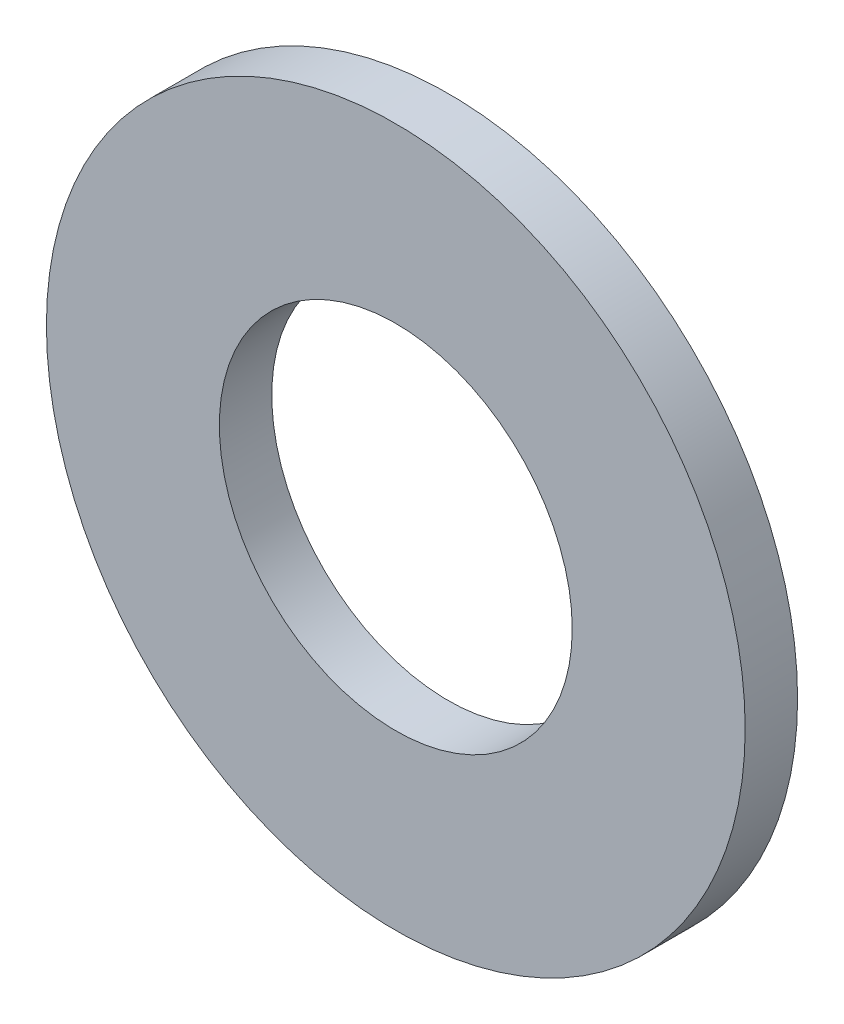
ISO-10303-21;
HEADER;
FILE_DESCRIPTION(('STEP AP214'),'2;1');
FILE_NAME('part.step','',(''),(''),'','','');
FILE_SCHEMA(('AUTOMOTIVE_DESIGN { 1 0 10303 214 1 1 1 1 }'));
ENDSEC;
DATA;
#1=APPLICATION_CONTEXT('core data for automotive mechanical design processes');
#2=APPLICATION_PROTOCOL_DEFINITION('international standard','automotive_design',2000,#1);
#3=PRODUCT_CONTEXT('',#1,'mechanical');
#4=PRODUCT('Part','Part','',(#3));
#5=PRODUCT_RELATED_PRODUCT_CATEGORY('part','',(#4));
#6=PRODUCT_DEFINITION_FORMATION('','',#4);
#7=PRODUCT_DEFINITION_CONTEXT('part definition',#1,'design');
#8=PRODUCT_DEFINITION('design','',#6,#7);
#9=PRODUCT_DEFINITION_SHAPE('','',#8);
#10=(LENGTH_UNIT() NAMED_UNIT(*) SI_UNIT(.MILLI.,.METRE.));
#11=(NAMED_UNIT(*) PLANE_ANGLE_UNIT() SI_UNIT($,.RADIAN.));
#12=(NAMED_UNIT(*) SI_UNIT($,.STERADIAN.) SOLID_ANGLE_UNIT());
#13=UNCERTAINTY_MEASURE_WITH_UNIT(LENGTH_MEASURE(1.E-05),#10,'distance_accuracy_value','');
#14=(GEOMETRIC_REPRESENTATION_CONTEXT(3) GLOBAL_UNCERTAINTY_ASSIGNED_CONTEXT((#13)) GLOBAL_UNIT_ASSIGNED_CONTEXT((#10,
#11,#12)) REPRESENTATION_CONTEXT('',''));
#15=CARTESIAN_POINT('',(0.,0.,0.));
#16=DIRECTION('',(0.,0.,1.));
#17=DIRECTION('',(1.,0.,0.));
#18=AXIS2_PLACEMENT_3D('',#15,#16,#17);
#19=CARTESIAN_POINT('',(0.,0.,1.5));
#20=DIRECTION('',(0.,0.,1.));
#21=DIRECTION('',(1.,0.,0.));
#22=AXIS2_PLACEMENT_3D('',#19,#20,#21);
#23=PLANE('',#22);
#24=CARTESIAN_POINT('',(0.,0.,1.5));
#25=DIRECTION('',(0.,0.,1.));
#26=DIRECTION('',(1.,0.,0.));
#27=AXIS2_PLACEMENT_3D('',#24,#25,#26);
#28=CIRCLE('',#27,20.);
#29=CARTESIAN_POINT('',(20.,0.,1.5));
#30=VERTEX_POINT('',#29);
#31=EDGE_CURVE('E10',#30,#30,#28,.T.);
#32=ORIENTED_EDGE('',*,*,#31,.T.);
#33=EDGE_LOOP('',(#32));
#34=FACE_BOUND('',#33,.T.);
#35=CARTESIAN_POINT('',(0.,0.,1.5));
#36=DIRECTION('',(0.,0.,1.));
#37=DIRECTION('',(1.,0.,0.));
#38=AXIS2_PLACEMENT_3D('',#35,#36,#37);
#39=CIRCLE('',#38,10.1);
#40=CARTESIAN_POINT('',(10.1,0.,1.5));
#41=VERTEX_POINT('',#40);
#42=EDGE_CURVE('E42',#41,#41,#39,.T.);
#43=ORIENTED_EDGE('',*,*,#42,.F.);
#44=EDGE_LOOP('',(#43));
#45=FACE_BOUND('',#44,.T.);
#46=ADVANCED_FACE('F31',(#34,#45),#23,.T.);
#47=CARTESIAN_POINT('',(0.,0.,-1.5));
#48=DIRECTION('',(0.,0.,1.));
#49=DIRECTION('',(1.,0.,0.));
#50=AXIS2_PLACEMENT_3D('',#47,#48,#49);
#51=PLANE('',#50);
#52=CARTESIAN_POINT('',(0.,0.,-1.5));
#53=DIRECTION('',(0.,0.,1.));
#54=DIRECTION('',(1.,0.,0.));
#55=AXIS2_PLACEMENT_3D('',#52,#53,#54);
#56=CIRCLE('',#55,20.);
#57=CARTESIAN_POINT('',(20.,0.,-1.5));
#58=VERTEX_POINT('',#57);
#59=EDGE_CURVE('E35',#58,#58,#56,.T.);
#60=ORIENTED_EDGE('',*,*,#59,.F.);
#61=EDGE_LOOP('',(#60));
#62=FACE_BOUND('',#61,.T.);
#63=CARTESIAN_POINT('',(0.,0.,-1.5));
#64=DIRECTION('',(0.,0.,1.));
#65=DIRECTION('',(1.,0.,0.));
#66=AXIS2_PLACEMENT_3D('',#63,#64,#65);
#67=CIRCLE('',#66,10.1);
#68=CARTESIAN_POINT('',(10.1,0.,-1.5));
#69=VERTEX_POINT('',#68);
#70=EDGE_CURVE('E44',#69,#69,#67,.T.);
#71=ORIENTED_EDGE('',*,*,#70,.T.);
#72=EDGE_LOOP('',(#71));
#73=FACE_BOUND('',#72,.T.);
#74=ADVANCED_FACE('F54',(#62,#73),#51,.F.);
#75=CARTESIAN_POINT('',(0.,0.,1.5));
#76=DIRECTION('',(0.,0.,-1.));
#77=DIRECTION('',(-1.,0.,0.));
#78=AXIS2_PLACEMENT_3D('',#75,#76,#77);
#79=CYLINDRICAL_SURFACE('',#78,20.);
#80=ORIENTED_EDGE('',*,*,#31,.F.);
#81=EDGE_LOOP('',(#80));
#82=FACE_BOUND('',#81,.T.);
#83=ORIENTED_EDGE('',*,*,#59,.T.);
#84=EDGE_LOOP('',(#83));
#85=FACE_BOUND('',#84,.T.);
#86=ADVANCED_FACE('F33',(#82,#85),#79,.T.);
#87=CARTESIAN_POINT('',(0.,0.,1.5));
#88=DIRECTION('',(0.,0.,-1.));
#89=DIRECTION('',(-1.,0.,0.));
#90=AXIS2_PLACEMENT_3D('',#87,#88,#89);
#91=CYLINDRICAL_SURFACE('',#90,10.1);
#92=ORIENTED_EDGE('',*,*,#42,.T.);
#93=EDGE_LOOP('',(#92));
#94=FACE_BOUND('',#93,.T.);
#95=ORIENTED_EDGE('',*,*,#70,.F.);
#96=EDGE_LOOP('',(#95));
#97=FACE_BOUND('',#96,.T.);
#98=ADVANCED_FACE('F50',(#94,#97),#91,.F.);
#99=CLOSED_SHELL('',(#46,#74,#86,#98));
#100=MANIFOLD_SOLID_BREP('B2',#99);
#101=ADVANCED_BREP_SHAPE_REPRESENTATION('',(#18,#100),#14);
#102=SHAPE_DEFINITION_REPRESENTATION(#9,#101);
ENDSEC;
END-ISO-10303-21;
